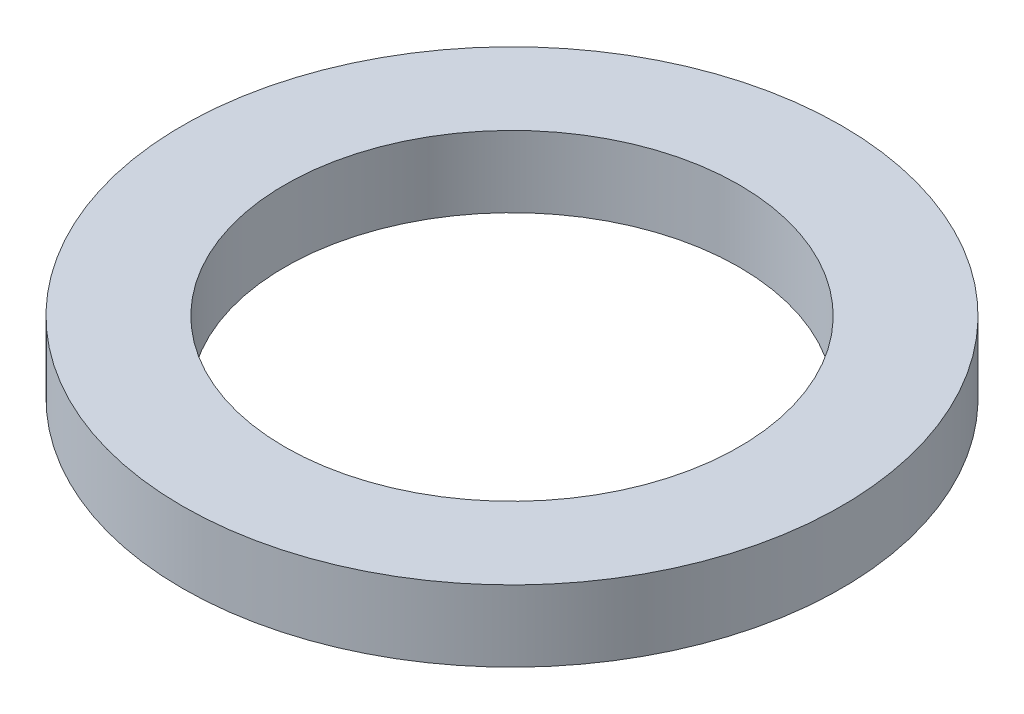
ISO-10303-21;
HEADER;
FILE_DESCRIPTION(('STEP AP214'),'2;1');
FILE_NAME('part.step','',(''),(''),'','','');
FILE_SCHEMA(('AUTOMOTIVE_DESIGN { 1 0 10303 214 1 1 1 1 }'));
ENDSEC;
DATA;
#1=APPLICATION_CONTEXT('core data for automotive mechanical design processes');
#2=APPLICATION_PROTOCOL_DEFINITION('international standard','automotive_design',2000,#1);
#3=PRODUCT_CONTEXT('',#1,'mechanical');
#4=PRODUCT('Part','Part','',(#3));
#5=PRODUCT_RELATED_PRODUCT_CATEGORY('part','',(#4));
#6=PRODUCT_DEFINITION_FORMATION('','',#4);
#7=PRODUCT_DEFINITION_CONTEXT('part definition',#1,'design');
#8=PRODUCT_DEFINITION('design','',#6,#7);
#9=PRODUCT_DEFINITION_SHAPE('','',#8);
#10=(LENGTH_UNIT() NAMED_UNIT(*) SI_UNIT(.MILLI.,.METRE.));
#11=(NAMED_UNIT(*) PLANE_ANGLE_UNIT() SI_UNIT($,.RADIAN.));
#12=(NAMED_UNIT(*) SI_UNIT($,.STERADIAN.) SOLID_ANGLE_UNIT());
#13=UNCERTAINTY_MEASURE_WITH_UNIT(LENGTH_MEASURE(1.E-05),#10,'distance_accuracy_value','');
#14=(GEOMETRIC_REPRESENTATION_CONTEXT(3) GLOBAL_UNCERTAINTY_ASSIGNED_CONTEXT((#13)) GLOBAL_UNIT_ASSIGNED_CONTEXT((#10,
#11,#12)) REPRESENTATION_CONTEXT('',''));
#15=CARTESIAN_POINT('',(0.,0.,0.));
#16=DIRECTION('',(0.,0.,1.));
#17=DIRECTION('',(1.,0.,0.));
#18=AXIS2_PLACEMENT_3D('',#15,#16,#17);
#19=CARTESIAN_POINT('',(0.,4.,0.));
#20=DIRECTION('',(0.,1.,0.));
#21=DIRECTION('',(0.,0.,1.));
#22=AXIS2_PLACEMENT_3D('',#19,#20,#21);
#23=PLANE('',#22);
#24=CARTESIAN_POINT('',(0.,4.,0.));
#25=DIRECTION('',(0.,1.,0.));
#26=DIRECTION('',(0.,0.,1.));
#27=AXIS2_PLACEMENT_3D('',#24,#25,#26);
#28=CIRCLE('',#27,18.5);
#29=CARTESIAN_POINT('',(0.,4.,18.5));
#30=VERTEX_POINT('',#29);
#31=EDGE_CURVE('E10',#30,#30,#28,.T.);
#32=ORIENTED_EDGE('',*,*,#31,.T.);
#33=EDGE_LOOP('',(#32));
#34=FACE_BOUND('',#33,.T.);
#35=CARTESIAN_POINT('',(0.,4.,0.));
#36=DIRECTION('',(0.,1.,0.));
#37=DIRECTION('',(0.,0.,1.));
#38=AXIS2_PLACEMENT_3D('',#35,#36,#37);
#39=CIRCLE('',#38,12.75);
#40=CARTESIAN_POINT('',(0.,4.,12.75));
#41=VERTEX_POINT('',#40);
#42=EDGE_CURVE('E46',#41,#41,#39,.T.);
#43=ORIENTED_EDGE('',*,*,#42,.F.);
#44=EDGE_LOOP('',(#43));
#45=FACE_BOUND('',#44,.T.);
#46=ADVANCED_FACE('F35',(#34,#45),#23,.T.);
#47=CARTESIAN_POINT('',(0.,0.,0.));
#48=DIRECTION('',(0.,1.,0.));
#49=DIRECTION('',(0.,0.,1.));
#50=AXIS2_PLACEMENT_3D('',#47,#48,#49);
#51=PLANE('',#50);
#52=CARTESIAN_POINT('',(0.,0.,0.));
#53=DIRECTION('',(0.,1.,0.));
#54=DIRECTION('',(0.,0.,1.));
#55=AXIS2_PLACEMENT_3D('',#52,#53,#54);
#56=CIRCLE('',#55,18.5);
#57=CARTESIAN_POINT('',(0.,0.,18.5));
#58=VERTEX_POINT('',#57);
#59=EDGE_CURVE('E39',#58,#58,#56,.T.);
#60=ORIENTED_EDGE('',*,*,#59,.F.);
#61=EDGE_LOOP('',(#60));
#62=FACE_BOUND('',#61,.T.);
#63=CARTESIAN_POINT('',(0.,0.,0.));
#64=DIRECTION('',(0.,1.,0.));
#65=DIRECTION('',(0.,0.,1.));
#66=AXIS2_PLACEMENT_3D('',#63,#64,#65);
#67=CIRCLE('',#66,12.75);
#68=CARTESIAN_POINT('',(0.,0.,12.75));
#69=VERTEX_POINT('',#68);
#70=EDGE_CURVE('E48',#69,#69,#67,.T.);
#71=ORIENTED_EDGE('',*,*,#70,.T.);
#72=EDGE_LOOP('',(#71));
#73=FACE_BOUND('',#72,.T.);
#74=ADVANCED_FACE('F58',(#62,#73),#51,.F.);
#75=CARTESIAN_POINT('',(0.,4.,0.));
#76=DIRECTION('',(0.,-1.,0.));
#77=DIRECTION('',(0.,0.,-1.));
#78=AXIS2_PLACEMENT_3D('',#75,#76,#77);
#79=CYLINDRICAL_SURFACE('',#78,18.5);
#80=ORIENTED_EDGE('',*,*,#31,.F.);
#81=EDGE_LOOP('',(#80));
#82=FACE_BOUND('',#81,.T.);
#83=ORIENTED_EDGE('',*,*,#59,.T.);
#84=EDGE_LOOP('',(#83));
#85=FACE_BOUND('',#84,.T.);
#86=ADVANCED_FACE('F37',(#82,#85),#79,.T.);
#87=CARTESIAN_POINT('',(0.,4.,0.));
#88=DIRECTION('',(0.,-1.,0.));
#89=DIRECTION('',(0.,0.,-1.));
#90=AXIS2_PLACEMENT_3D('',#87,#88,#89);
#91=CYLINDRICAL_SURFACE('',#90,12.75);
#92=ORIENTED_EDGE('',*,*,#42,.T.);
#93=EDGE_LOOP('',(#92));
#94=FACE_BOUND('',#93,.T.);
#95=ORIENTED_EDGE('',*,*,#70,.F.);
#96=EDGE_LOOP('',(#95));
#97=FACE_BOUND('',#96,.T.);
#98=ADVANCED_FACE('F54',(#94,#97),#91,.F.);
#99=CLOSED_SHELL('',(#46,#74,#86,#98));
#100=MANIFOLD_SOLID_BREP('B2',#99);
#101=ADVANCED_BREP_SHAPE_REPRESENTATION('',(#18,#100),#14);
#102=SHAPE_DEFINITION_REPRESENTATION(#9,#101);
ENDSEC;
END-ISO-10303-21;
